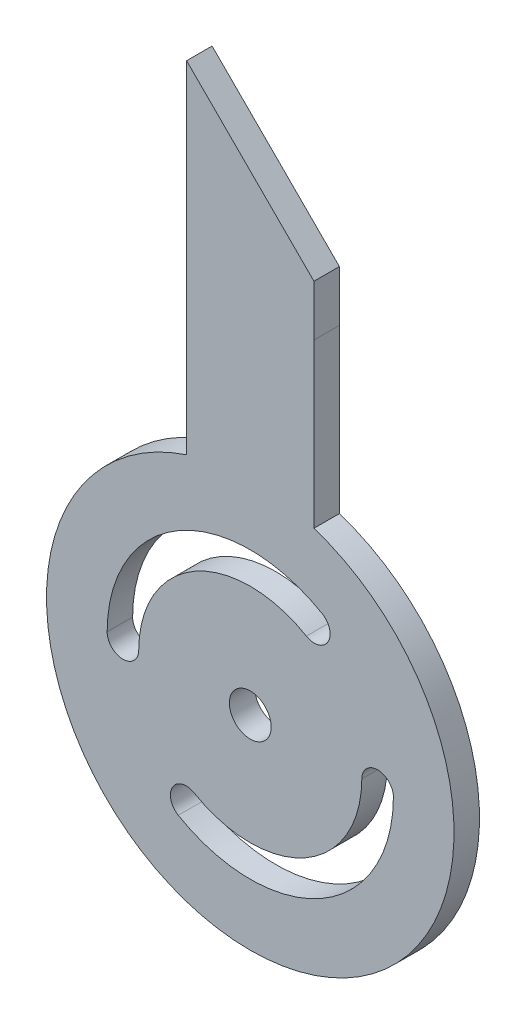
ISO-10303-21;
HEADER;
FILE_DESCRIPTION(('STEP AP214'),'2;1');
FILE_NAME('part.step','',(''),(''),'','','');
FILE_SCHEMA(('AUTOMOTIVE_DESIGN { 1 0 10303 214 1 1 1 1 }'));
ENDSEC;
DATA;
#1=APPLICATION_CONTEXT('core data for automotive mechanical design processes');
#2=APPLICATION_PROTOCOL_DEFINITION('international standard','automotive_design',2000,#1);
#3=PRODUCT_CONTEXT('',#1,'mechanical');
#4=PRODUCT('Part','Part','',(#3));
#5=PRODUCT_RELATED_PRODUCT_CATEGORY('part','',(#4));
#6=PRODUCT_DEFINITION_FORMATION('','',#4);
#7=PRODUCT_DEFINITION_CONTEXT('part definition',#1,'design');
#8=PRODUCT_DEFINITION('design','',#6,#7);
#9=PRODUCT_DEFINITION_SHAPE('','',#8);
#10=(LENGTH_UNIT() NAMED_UNIT(*) SI_UNIT(.MILLI.,.METRE.));
#11=(NAMED_UNIT(*) PLANE_ANGLE_UNIT() SI_UNIT($,.RADIAN.));
#12=(NAMED_UNIT(*) SI_UNIT($,.STERADIAN.) SOLID_ANGLE_UNIT());
#13=UNCERTAINTY_MEASURE_WITH_UNIT(LENGTH_MEASURE(1.E-05),#10,'distance_accuracy_value','');
#14=(GEOMETRIC_REPRESENTATION_CONTEXT(3) GLOBAL_UNCERTAINTY_ASSIGNED_CONTEXT((#13)) GLOBAL_UNIT_ASSIGNED_CONTEXT((#10,
#11,#12)) REPRESENTATION_CONTEXT('',''));
#15=CARTESIAN_POINT('',(0.,0.,0.));
#16=DIRECTION('',(0.,0.,1.));
#17=DIRECTION('',(1.,0.,0.));
#18=AXIS2_PLACEMENT_3D('',#15,#16,#17);
#19=CARTESIAN_POINT('',(0.,0.,5.));
#20=DIRECTION('',(0.,0.,1.));
#21=DIRECTION('',(1.,0.,0.));
#22=AXIS2_PLACEMENT_3D('',#19,#20,#21);
#23=PLANE('',#22);
#24=DIRECTION('',(-0.707141118954938,0.707072441750602,0.));
#25=VECTOR('',#24,1.);
#26=CARTESIAN_POINT('',(12.5024282237675,80.0000000000137,5.));
#27=LINE('',#26,#25);
#28=CARTESIAN_POINT('',(12.5024282237675,80.0000000000137,5.));
#29=VERTEX_POINT('',#28);
#30=CARTESIAN_POINT('',(-12.4975717762325,104.997572012074,5.));
#31=VERTEX_POINT('',#30);
#32=EDGE_CURVE('E52',#29,#31,#27,.T.);
#33=ORIENTED_EDGE('',*,*,#32,.T.);
#34=DIRECTION('',(0.,1.,0.));
#35=VECTOR('',#34,1.);
#36=CARTESIAN_POINT('',(-12.4975717762325,70.0000000000137,5.));
#37=LINE('',#36,#35);
#38=CARTESIAN_POINT('',(-12.4975717762325,94.9975720120604,5.));
#39=VERTEX_POINT('',#38);
#40=EDGE_CURVE('E190',#39,#31,#37,.T.);
#41=ORIENTED_EDGE('',*,*,#40,.F.);
#42=DIRECTION('',(0.707141118955131,-0.707072441750409,0.));
#43=VECTOR('',#42,1.);
#44=CARTESIAN_POINT('',(-12.5,95.,5.));
#45=LINE('',#44,#43);
#46=CARTESIAN_POINT('',(-12.5,95.,5.));
#47=VERTEX_POINT('',#46);
#48=EDGE_CURVE('E253',#47,#39,#45,.T.);
#49=ORIENTED_EDGE('',*,*,#48,.F.);
#50=DIRECTION('',(0.,-1.,0.));
#51=VECTOR('',#50,1.);
#52=CARTESIAN_POINT('',(-12.5,70.,5.));
#53=LINE('',#52,#51);
#54=CARTESIAN_POINT('',(-12.5,37.9967103839266,5.));
#55=VERTEX_POINT('',#54);
#56=EDGE_CURVE('E242',#47,#55,#53,.T.);
#57=ORIENTED_EDGE('',*,*,#56,.T.);
#58=CARTESIAN_POINT('',(0.,0.,5.));
#59=DIRECTION('',(0.,0.,1.));
#60=DIRECTION('',(1.,0.,0.));
#61=AXIS2_PLACEMENT_3D('',#58,#59,#60);
#62=CIRCLE('',#61,40.);
#63=CARTESIAN_POINT('',(12.5,37.9967103839266,5.));
#64=VERTEX_POINT('',#63);
#65=EDGE_CURVE('E266',#55,#64,#62,.T.);
#66=ORIENTED_EDGE('',*,*,#65,.T.);
#67=DIRECTION('',(0.,1.,0.));
#68=VECTOR('',#67,1.);
#69=CARTESIAN_POINT('',(12.5,70.,5.));
#70=LINE('',#69,#68);
#71=CARTESIAN_POINT('',(12.5012141118837,70.0000000000137,5.));
#72=VERTEX_POINT('',#71);
#73=EDGE_CURVE('E250',#64,#72,#70,.T.);
#74=ORIENTED_EDGE('',*,*,#73,.T.);
#75=DIRECTION('',(0.,-1.,0.));
#76=VECTOR('',#75,1.);
#77=CARTESIAN_POINT('',(12.5024282237675,70.0000000000137,5.));
#78=LINE('',#77,#76);
#79=EDGE_CURVE('E38',#29,#72,#78,.T.);
#80=ORIENTED_EDGE('',*,*,#79,.F.);
#81=EDGE_LOOP('',(#33,#41,#49,#57,#66,#74,#80));
#82=FACE_BOUND('',#81,.T.);
#83=CARTESIAN_POINT('',(25.0004408613556,0.0857187054202668,5.));
#84=DIRECTION('',(0.,0.,-1.));
#85=DIRECTION('',(-1.,0.,0.));
#86=AXIS2_PLACEMENT_3D('',#83,#84,#85);
#87=CIRCLE('',#86,3.1);
#88=CARTESIAN_POINT('',(21.9004590836964,0.0963478248924698,5.));
#89=VERTEX_POINT('',#88);
#90=CARTESIAN_POINT('',(28.1004226390149,0.0750895859480742,5.));
#91=VERTEX_POINT('',#90);
#92=EDGE_CURVE('E175',#89,#91,#87,.T.);
#93=ORIENTED_EDGE('',*,*,#92,.T.);
#94=CARTESIAN_POINT('',(0.000587815716733553,0.171437410841222,5.));
#95=DIRECTION('',(0.,0.,-1.));
#96=DIRECTION('',(-1.,0.,0.));
#97=AXIS2_PLACEMENT_3D('',#94,#95,#96);
#98=CIRCLE('',#97,28.1);
#99=CARTESIAN_POINT('',(-14.1327692598893,-24.1155594758349,5.));
#100=VERTEX_POINT('',#99);
#101=EDGE_CURVE('E178',#91,#100,#98,.T.);
#102=ORIENTED_EDGE('',*,*,#101,.T.);
#103=CARTESIAN_POINT('',(-12.5735732835769,-21.4362110648493,5.));
#104=DIRECTION('',(0.,0.,-1.));
#105=DIRECTION('',(-1.,0.,0.));
#106=AXIS2_PLACEMENT_3D('',#103,#104,#105);
#107=CIRCLE('',#106,3.1);
#108=CARTESIAN_POINT('',(-11.0143773072645,-18.7568626538637,5.));
#109=VERTEX_POINT('',#108);
#110=EDGE_CURVE('E60',#100,#109,#107,.T.);
#111=ORIENTED_EDGE('',*,*,#110,.T.);
#112=CARTESIAN_POINT('',(0.000587815716733553,0.171437410841222,5.));
#113=DIRECTION('',(0.,0.,1.));
#114=DIRECTION('',(-1.,0.,0.));
#115=AXIS2_PLACEMENT_3D('',#112,#113,#114);
#116=CIRCLE('',#115,21.9);
#117=EDGE_CURVE('E183',#109,#89,#116,.T.);
#118=ORIENTED_EDGE('',*,*,#117,.T.);
#119=EDGE_LOOP('',(#93,#102,#111,#118));
#120=FACE_BOUND('',#119,.T.);
#121=CARTESIAN_POINT('',(-24.9998530456389,0.0857187054211297,5.));
#122=DIRECTION('',(0.,0.,-1.));
#123=DIRECTION('',(-1.,0.,0.));
#124=AXIS2_PLACEMENT_3D('',#121,#122,#123);
#125=CIRCLE('',#124,3.1);
#126=CARTESIAN_POINT('',(-21.8998712679797,0.0750895859489096,5.));
#127=VERTEX_POINT('',#126);
#128=CARTESIAN_POINT('',(-28.0998348232981,0.0963478248933498,5.));
#129=VERTEX_POINT('',#128);
#130=EDGE_CURVE('E207',#127,#129,#125,.T.);
#131=ORIENTED_EDGE('',*,*,#130,.T.);
#132=CARTESIAN_POINT('',(0.,0.,5.));
#133=DIRECTION('',(0.,0.,-1.));
#134=DIRECTION('',(-1.,0.,0.));
#135=AXIS2_PLACEMENT_3D('',#132,#133,#134);
#136=CIRCLE('',#135,28.1);
#137=CARTESIAN_POINT('',(14.1333570756062,24.2869968866761,5.));
#138=VERTEX_POINT('',#137);
#139=EDGE_CURVE('E210',#129,#138,#136,.T.);
#140=ORIENTED_EDGE('',*,*,#139,.T.);
#141=CARTESIAN_POINT('',(12.5741610992938,21.6076484756904,5.));
#142=DIRECTION('',(0.,0.,-1.));
#143=DIRECTION('',(-1.,0.,0.));
#144=AXIS2_PLACEMENT_3D('',#141,#142,#143);
#145=CIRCLE('',#144,3.1);
#146=CARTESIAN_POINT('',(11.0149651229813,18.9283000647048,5.));
#147=VERTEX_POINT('',#146);
#148=EDGE_CURVE('E214',#138,#147,#145,.T.);
#149=ORIENTED_EDGE('',*,*,#148,.T.);
#150=CARTESIAN_POINT('',(0.,0.,5.));
#151=DIRECTION('',(0.,0.,1.));
#152=DIRECTION('',(-1.,0.,0.));
#153=AXIS2_PLACEMENT_3D('',#150,#151,#152);
#154=CIRCLE('',#153,21.9);
#155=EDGE_CURVE('E217',#147,#127,#154,.T.);
#156=ORIENTED_EDGE('',*,*,#155,.T.);
#157=EDGE_LOOP('',(#131,#140,#149,#156));
#158=FACE_BOUND('',#157,.T.);
#159=CARTESIAN_POINT('',(0.,0.,5.));
#160=DIRECTION('',(0.,0.,-1.));
#161=DIRECTION('',(-1.,0.,0.));
#162=AXIS2_PLACEMENT_3D('',#159,#160,#161);
#163=CIRCLE('',#162,4.1);
#164=CARTESIAN_POINT('',(-4.1,0.,5.));
#165=VERTEX_POINT('',#164);
#166=EDGE_CURVE('E239',#165,#165,#163,.T.);
#167=ORIENTED_EDGE('',*,*,#166,.T.);
#168=EDGE_LOOP('',(#167));
#169=FACE_BOUND('',#168,.T.);
#170=ADVANCED_FACE('F35',(#82,#120,#158,#169),#23,.T.);
#171=CARTESIAN_POINT('',(0.,0.,0.));
#172=DIRECTION('',(0.,0.,1.));
#173=DIRECTION('',(1.,0.,0.));
#174=AXIS2_PLACEMENT_3D('',#171,#172,#173);
#175=PLANE('',#174);
#176=CARTESIAN_POINT('',(0.000587815716733553,0.171437410841222,0.));
#177=DIRECTION('',(0.,0.,-1.));
#178=DIRECTION('',(-1.,0.,0.));
#179=AXIS2_PLACEMENT_3D('',#176,#177,#178);
#180=CIRCLE('',#179,28.1);
#181=CARTESIAN_POINT('',(28.1004226390149,0.0750895859480742,0.));
#182=VERTEX_POINT('',#181);
#183=CARTESIAN_POINT('',(-14.1327692598893,-24.1155594758349,0.));
#184=VERTEX_POINT('',#183);
#185=EDGE_CURVE('E189',#182,#184,#180,.T.);
#186=ORIENTED_EDGE('',*,*,#185,.F.);
#187=CARTESIAN_POINT('',(25.0004408613556,0.0857187054202668,0.));
#188=DIRECTION('',(0.,0.,-1.));
#189=DIRECTION('',(-1.,0.,0.));
#190=AXIS2_PLACEMENT_3D('',#187,#188,#189);
#191=CIRCLE('',#190,3.1);
#192=CARTESIAN_POINT('',(21.9004590836964,0.0963478248924698,0.));
#193=VERTEX_POINT('',#192);
#194=EDGE_CURVE('E187',#193,#182,#191,.T.);
#195=ORIENTED_EDGE('',*,*,#194,.F.);
#196=CARTESIAN_POINT('',(0.000587815716733553,0.171437410841222,0.));
#197=DIRECTION('',(0.,0.,1.));
#198=DIRECTION('',(-1.,0.,0.));
#199=AXIS2_PLACEMENT_3D('',#196,#197,#198);
#200=CIRCLE('',#199,21.9);
#201=CARTESIAN_POINT('',(-11.0143773072645,-18.7568626538637,0.));
#202=VERTEX_POINT('',#201);
#203=EDGE_CURVE('E179',#202,#193,#200,.T.);
#204=ORIENTED_EDGE('',*,*,#203,.F.);
#205=CARTESIAN_POINT('',(-12.5735732835769,-21.4362110648493,0.));
#206=DIRECTION('',(0.,0.,-1.));
#207=DIRECTION('',(-1.,0.,0.));
#208=AXIS2_PLACEMENT_3D('',#205,#206,#207);
#209=CIRCLE('',#208,3.1);
#210=EDGE_CURVE('E193',#184,#202,#209,.T.);
#211=ORIENTED_EDGE('',*,*,#210,.F.);
#212=EDGE_LOOP('',(#186,#195,#204,#211));
#213=FACE_BOUND('',#212,.T.);
#214=CARTESIAN_POINT('',(0.,0.,0.));
#215=DIRECTION('',(0.,0.,-1.));
#216=DIRECTION('',(-1.,0.,0.));
#217=AXIS2_PLACEMENT_3D('',#214,#215,#216);
#218=CIRCLE('',#217,28.1);
#219=CARTESIAN_POINT('',(-28.0998348232981,0.0963478248933498,0.));
#220=VERTEX_POINT('',#219);
#221=CARTESIAN_POINT('',(14.1333570756062,24.2869968866761,0.));
#222=VERTEX_POINT('',#221);
#223=EDGE_CURVE('E222',#220,#222,#218,.T.);
#224=ORIENTED_EDGE('',*,*,#223,.F.);
#225=CARTESIAN_POINT('',(-24.9998530456389,0.0857187054211297,0.));
#226=DIRECTION('',(0.,0.,-1.));
#227=DIRECTION('',(-1.,0.,0.));
#228=AXIS2_PLACEMENT_3D('',#225,#226,#227);
#229=CIRCLE('',#228,3.1);
#230=CARTESIAN_POINT('',(-21.8998712679797,0.0750895859489096,0.));
#231=VERTEX_POINT('',#230);
#232=EDGE_CURVE('E200',#231,#220,#229,.T.);
#233=ORIENTED_EDGE('',*,*,#232,.F.);
#234=CARTESIAN_POINT('',(0.,0.,0.));
#235=DIRECTION('',(0.,0.,1.));
#236=DIRECTION('',(-1.,0.,0.));
#237=AXIS2_PLACEMENT_3D('',#234,#235,#236);
#238=CIRCLE('',#237,21.9);
#239=CARTESIAN_POINT('',(11.0149651229813,18.9283000647048,0.));
#240=VERTEX_POINT('',#239);
#241=EDGE_CURVE('E211',#240,#231,#238,.T.);
#242=ORIENTED_EDGE('',*,*,#241,.F.);
#243=CARTESIAN_POINT('',(12.5741610992938,21.6076484756904,0.));
#244=DIRECTION('',(0.,0.,-1.));
#245=DIRECTION('',(-1.,0.,0.));
#246=AXIS2_PLACEMENT_3D('',#243,#244,#245);
#247=CIRCLE('',#246,3.1);
#248=EDGE_CURVE('E225',#222,#240,#247,.T.);
#249=ORIENTED_EDGE('',*,*,#248,.F.);
#250=EDGE_LOOP('',(#224,#233,#242,#249));
#251=FACE_BOUND('',#250,.T.);
#252=CARTESIAN_POINT('',(0.,0.,0.));
#253=DIRECTION('',(0.,0.,-1.));
#254=DIRECTION('',(-1.,0.,0.));
#255=AXIS2_PLACEMENT_3D('',#252,#253,#254);
#256=CIRCLE('',#255,4.1);
#257=CARTESIAN_POINT('',(-4.1,0.,0.));
#258=VERTEX_POINT('',#257);
#259=EDGE_CURVE('E232',#258,#258,#256,.T.);
#260=ORIENTED_EDGE('',*,*,#259,.F.);
#261=EDGE_LOOP('',(#260));
#262=FACE_BOUND('',#261,.T.);
#263=DIRECTION('',(0.,1.,0.));
#264=VECTOR('',#263,1.);
#265=CARTESIAN_POINT('',(-12.4975717762325,70.0000000000137,0.));
#266=LINE('',#265,#264);
#267=CARTESIAN_POINT('',(-12.4975717762325,94.9975720120604,0.));
#268=VERTEX_POINT('',#267);
#269=CARTESIAN_POINT('',(-12.4975717762325,104.997572012074,0.));
#270=VERTEX_POINT('',#269);
#271=EDGE_CURVE('E157',#268,#270,#266,.T.);
#272=ORIENTED_EDGE('',*,*,#271,.T.);
#273=DIRECTION('',(-0.707141118954938,0.707072441750602,0.));
#274=VECTOR('',#273,1.);
#275=CARTESIAN_POINT('',(12.5024282237675,80.0000000000137,0.));
#276=LINE('',#275,#274);
#277=CARTESIAN_POINT('',(12.5024282237675,80.0000000000137,0.));
#278=VERTEX_POINT('',#277);
#279=EDGE_CURVE('E144',#278,#270,#276,.T.);
#280=ORIENTED_EDGE('',*,*,#279,.F.);
#281=DIRECTION('',(0.,-1.,0.));
#282=VECTOR('',#281,1.);
#283=CARTESIAN_POINT('',(12.5024282237675,70.0000000000137,0.));
#284=LINE('',#283,#282);
#285=CARTESIAN_POINT('',(12.5012141118837,70.0000000000137,0.));
#286=VERTEX_POINT('',#285);
#287=EDGE_CURVE('E154',#278,#286,#284,.T.);
#288=ORIENTED_EDGE('',*,*,#287,.T.);
#289=DIRECTION('',(0.,1.,0.));
#290=VECTOR('',#289,1.);
#291=CARTESIAN_POINT('',(12.5,70.,0.));
#292=LINE('',#291,#290);
#293=CARTESIAN_POINT('',(12.5,37.9967103839266,0.));
#294=VERTEX_POINT('',#293);
#295=EDGE_CURVE('E259',#294,#286,#292,.T.);
#296=ORIENTED_EDGE('',*,*,#295,.F.);
#297=CARTESIAN_POINT('',(0.,0.,0.));
#298=DIRECTION('',(0.,0.,1.));
#299=DIRECTION('',(1.,0.,0.));
#300=AXIS2_PLACEMENT_3D('',#297,#298,#299);
#301=CIRCLE('',#300,40.);
#302=CARTESIAN_POINT('',(-12.5,37.9967103839266,0.));
#303=VERTEX_POINT('',#302);
#304=EDGE_CURVE('E249',#303,#294,#301,.T.);
#305=ORIENTED_EDGE('',*,*,#304,.F.);
#306=DIRECTION('',(0.,-1.,0.));
#307=VECTOR('',#306,1.);
#308=CARTESIAN_POINT('',(-12.5,70.,0.));
#309=LINE('',#308,#307);
#310=CARTESIAN_POINT('',(-12.5,95.,0.));
#311=VERTEX_POINT('',#310);
#312=EDGE_CURVE('E256',#311,#303,#309,.T.);
#313=ORIENTED_EDGE('',*,*,#312,.F.);
#314=DIRECTION('',(0.707141118955131,-0.707072441750409,0.));
#315=VECTOR('',#314,1.);
#316=CARTESIAN_POINT('',(-12.5,95.,0.));
#317=LINE('',#316,#315);
#318=EDGE_CURVE('E247',#311,#268,#317,.T.);
#319=ORIENTED_EDGE('',*,*,#318,.T.);
#320=EDGE_LOOP('',(#272,#280,#288,#296,#305,#313,#319));
#321=FACE_BOUND('',#320,.T.);
#322=ADVANCED_FACE('F153',(#213,#251,#262,#321),#175,.F.);
#323=CARTESIAN_POINT('',(0.,0.,5.));
#324=DIRECTION('',(0.,0.,-1.));
#325=DIRECTION('',(-1.,0.,0.));
#326=AXIS2_PLACEMENT_3D('',#323,#324,#325);
#327=CYLINDRICAL_SURFACE('',#326,40.);
#328=ORIENTED_EDGE('',*,*,#304,.T.);
#329=DIRECTION('',(0.,0.,-1.));
#330=VECTOR('',#329,1.);
#331=CARTESIAN_POINT('',(12.5,37.9967103839266,5.));
#332=LINE('',#331,#330);
#333=EDGE_CURVE('E483',#64,#294,#332,.T.);
#334=ORIENTED_EDGE('',*,*,#333,.F.);
#335=ORIENTED_EDGE('',*,*,#65,.F.);
#336=DIRECTION('',(0.,0.,-1.));
#337=VECTOR('',#336,1.);
#338=CARTESIAN_POINT('',(-12.5,37.9967103839266,5.));
#339=LINE('',#338,#337);
#340=EDGE_CURVE('E261',#55,#303,#339,.T.);
#341=ORIENTED_EDGE('',*,*,#340,.T.);
#342=EDGE_LOOP('',(#328,#334,#335,#341));
#343=FACE_BOUND('',#342,.T.);
#344=ADVANCED_FACE('F283',(#343),#327,.T.);
#345=CARTESIAN_POINT('',(12.5,70.,5.));
#346=DIRECTION('',(-1.,0.,0.));
#347=DIRECTION('',(0.,-1.,0.));
#348=AXIS2_PLACEMENT_3D('',#345,#346,#347);
#349=PLANE('',#348);
#350=ORIENTED_EDGE('',*,*,#295,.T.);
#351=CARTESIAN_POINT('',(12.5024282237675,70.0000000000137,5.));
#352=DIRECTION('',(0.,0.,-1.));
#353=VECTOR('',#352,1.);
#354=LINE('',#351,#353);
#355=EDGE_CURVE('E161',#72,#286,#354,.T.);
#356=ORIENTED_EDGE('',*,*,#355,.F.);
#357=ORIENTED_EDGE('',*,*,#73,.F.);
#358=ORIENTED_EDGE('',*,*,#333,.T.);
#359=EDGE_LOOP('',(#350,#356,#357,#358));
#360=FACE_BOUND('',#359,.T.);
#361=ADVANCED_FACE('F272',(#360),#349,.F.);
#362=CARTESIAN_POINT('',(-12.5,70.,5.));
#363=DIRECTION('',(1.,0.,0.));
#364=DIRECTION('',(0.,1.,0.));
#365=AXIS2_PLACEMENT_3D('',#362,#363,#364);
#366=PLANE('',#365);
#367=ORIENTED_EDGE('',*,*,#312,.T.);
#368=ORIENTED_EDGE('',*,*,#340,.F.);
#369=ORIENTED_EDGE('',*,*,#56,.F.);
#370=DIRECTION('',(0.,0.,1.));
#371=VECTOR('',#370,1.);
#372=CARTESIAN_POINT('',(-12.5,95.,0.));
#373=LINE('',#372,#371);
#374=EDGE_CURVE('E44',#311,#47,#373,.T.);
#375=ORIENTED_EDGE('',*,*,#374,.F.);
#376=EDGE_LOOP('',(#367,#368,#369,#375));
#377=FACE_BOUND('',#376,.T.);
#378=ADVANCED_FACE('F282',(#377),#366,.F.);
#379=CARTESIAN_POINT('',(-12.5,95.,0.));
#380=DIRECTION('',(-0.707072441750409,-0.707141118955131,0.));
#381=DIRECTION('',(0.707141118955131,-0.707072441750409,0.));
#382=AXIS2_PLACEMENT_3D('',#379,#380,#381);
#383=PLANE('',#382);
#384=ORIENTED_EDGE('',*,*,#48,.T.);
#385=DIRECTION('',(0.,0.,-1.));
#386=VECTOR('',#385,1.);
#387=CARTESIAN_POINT('',(-12.4975717762325,94.9975720120604,0.));
#388=LINE('',#387,#386);
#389=EDGE_CURVE('E11',#39,#268,#388,.T.);
#390=ORIENTED_EDGE('',*,*,#389,.T.);
#391=ORIENTED_EDGE('',*,*,#318,.F.);
#392=ORIENTED_EDGE('',*,*,#374,.T.);
#393=EDGE_LOOP('',(#384,#390,#391,#392));
#394=FACE_BOUND('',#393,.T.);
#395=ADVANCED_FACE('F288',(#394),#383,.F.);
#396=CARTESIAN_POINT('',(0.,0.,5.));
#397=DIRECTION('',(0.,0.,-1.));
#398=DIRECTION('',(-1.,0.,0.));
#399=AXIS2_PLACEMENT_3D('',#396,#397,#398);
#400=CYLINDRICAL_SURFACE('',#399,4.1);
#401=ORIENTED_EDGE('',*,*,#166,.F.);
#402=EDGE_LOOP('',(#401));
#403=FACE_BOUND('',#402,.T.);
#404=ORIENTED_EDGE('',*,*,#259,.T.);
#405=EDGE_LOOP('',(#404));
#406=FACE_BOUND('',#405,.T.);
#407=ADVANCED_FACE('F291',(#403,#406),#400,.F.);
#408=CARTESIAN_POINT('',(-24.9998530456389,0.0857187054211297,5.));
#409=DIRECTION('',(0.,0.,-1.));
#410=DIRECTION('',(-1.,0.,0.));
#411=AXIS2_PLACEMENT_3D('',#408,#409,#410);
#412=CYLINDRICAL_SURFACE('',#411,3.1);
#413=ORIENTED_EDGE('',*,*,#232,.T.);
#414=DIRECTION('',(0.,0.,-1.));
#415=VECTOR('',#414,1.);
#416=CARTESIAN_POINT('',(-28.0998348232981,0.0963478248933498,5.));
#417=LINE('',#416,#415);
#418=EDGE_CURVE('E220',#129,#220,#417,.T.);
#419=ORIENTED_EDGE('',*,*,#418,.F.);
#420=ORIENTED_EDGE('',*,*,#130,.F.);
#421=DIRECTION('',(0.,0.,-1.));
#422=VECTOR('',#421,1.);
#423=CARTESIAN_POINT('',(-21.8998712679797,0.0750895859489096,5.));
#424=LINE('',#423,#422);
#425=EDGE_CURVE('E230',#127,#231,#424,.T.);
#426=ORIENTED_EDGE('',*,*,#425,.T.);
#427=EDGE_LOOP('',(#413,#419,#420,#426));
#428=FACE_BOUND('',#427,.T.);
#429=ADVANCED_FACE('F312',(#428),#412,.F.);
#430=CARTESIAN_POINT('',(0.,0.,5.));
#431=DIRECTION('',(0.,0.,-1.));
#432=DIRECTION('',(-1.,0.,0.));
#433=AXIS2_PLACEMENT_3D('',#430,#431,#432);
#434=CYLINDRICAL_SURFACE('',#433,21.9);
#435=ORIENTED_EDGE('',*,*,#241,.T.);
#436=ORIENTED_EDGE('',*,*,#425,.F.);
#437=ORIENTED_EDGE('',*,*,#155,.F.);
#438=DIRECTION('',(0.,0.,-1.));
#439=VECTOR('',#438,1.);
#440=CARTESIAN_POINT('',(11.0149651229813,18.9283000647048,5.));
#441=LINE('',#440,#439);
#442=EDGE_CURVE('E233',#147,#240,#441,.T.);
#443=ORIENTED_EDGE('',*,*,#442,.T.);
#444=EDGE_LOOP('',(#435,#436,#437,#443));
#445=FACE_BOUND('',#444,.T.);
#446=ADVANCED_FACE('F317',(#445),#434,.T.);
#447=CARTESIAN_POINT('',(12.5741610992938,21.6076484756904,5.));
#448=DIRECTION('',(0.,0.,-1.));
#449=DIRECTION('',(-1.,0.,0.));
#450=AXIS2_PLACEMENT_3D('',#447,#448,#449);
#451=CYLINDRICAL_SURFACE('',#450,3.1);
#452=ORIENTED_EDGE('',*,*,#248,.T.);
#453=ORIENTED_EDGE('',*,*,#442,.F.);
#454=ORIENTED_EDGE('',*,*,#148,.F.);
#455=DIRECTION('',(0.,0.,-1.));
#456=VECTOR('',#455,1.);
#457=CARTESIAN_POINT('',(14.1333570756062,24.2869968866761,5.));
#458=LINE('',#457,#456);
#459=EDGE_CURVE('E235',#138,#222,#458,.T.);
#460=ORIENTED_EDGE('',*,*,#459,.T.);
#461=EDGE_LOOP('',(#452,#453,#454,#460));
#462=FACE_BOUND('',#461,.T.);
#463=ADVANCED_FACE('F326',(#462),#451,.F.);
#464=CARTESIAN_POINT('',(0.,0.,5.));
#465=DIRECTION('',(0.,0.,-1.));
#466=DIRECTION('',(-1.,0.,0.));
#467=AXIS2_PLACEMENT_3D('',#464,#465,#466);
#468=CYLINDRICAL_SURFACE('',#467,28.1);
#469=ORIENTED_EDGE('',*,*,#223,.T.);
#470=ORIENTED_EDGE('',*,*,#459,.F.);
#471=ORIENTED_EDGE('',*,*,#139,.F.);
#472=ORIENTED_EDGE('',*,*,#418,.T.);
#473=EDGE_LOOP('',(#469,#470,#471,#472));
#474=FACE_BOUND('',#473,.T.);
#475=ADVANCED_FACE('F322',(#474),#468,.F.);
#476=CARTESIAN_POINT('',(25.0004408613556,0.0857187054202668,5.));
#477=DIRECTION('',(0.,0.,-1.));
#478=DIRECTION('',(-1.,0.,0.));
#479=AXIS2_PLACEMENT_3D('',#476,#477,#478);
#480=CYLINDRICAL_SURFACE('',#479,3.1);
#481=ORIENTED_EDGE('',*,*,#194,.T.);
#482=DIRECTION('',(0.,0.,-1.));
#483=VECTOR('',#482,1.);
#484=CARTESIAN_POINT('',(28.1004226390149,0.0750895859480742,5.));
#485=LINE('',#484,#483);
#486=EDGE_CURVE('E186',#91,#182,#485,.T.);
#487=ORIENTED_EDGE('',*,*,#486,.F.);
#488=ORIENTED_EDGE('',*,*,#92,.F.);
#489=DIRECTION('',(0.,0.,-1.));
#490=VECTOR('',#489,1.);
#491=CARTESIAN_POINT('',(21.9004590836964,0.0963478248924698,5.));
#492=LINE('',#491,#490);
#493=EDGE_CURVE('E198',#89,#193,#492,.T.);
#494=ORIENTED_EDGE('',*,*,#493,.T.);
#495=EDGE_LOOP('',(#481,#487,#488,#494));
#496=FACE_BOUND('',#495,.T.);
#497=ADVANCED_FACE('F325',(#496),#480,.F.);
#498=CARTESIAN_POINT('',(0.000587815716733553,0.171437410841222,5.));
#499=DIRECTION('',(0.,0.,-1.));
#500=DIRECTION('',(-1.,0.,0.));
#501=AXIS2_PLACEMENT_3D('',#498,#499,#500);
#502=CYLINDRICAL_SURFACE('',#501,21.9);
#503=ORIENTED_EDGE('',*,*,#203,.T.);
#504=ORIENTED_EDGE('',*,*,#493,.F.);
#505=ORIENTED_EDGE('',*,*,#117,.F.);
#506=DIRECTION('',(0.,0.,-1.));
#507=VECTOR('',#506,1.);
#508=CARTESIAN_POINT('',(-11.0143773072645,-18.7568626538637,5.));
#509=LINE('',#508,#507);
#510=EDGE_CURVE('E201',#109,#202,#509,.T.);
#511=ORIENTED_EDGE('',*,*,#510,.T.);
#512=EDGE_LOOP('',(#503,#504,#505,#511));
#513=FACE_BOUND('',#512,.T.);
#514=ADVANCED_FACE('F336',(#513),#502,.T.);
#515=CARTESIAN_POINT('',(-12.5735732835769,-21.4362110648493,5.));
#516=DIRECTION('',(0.,0.,-1.));
#517=DIRECTION('',(-1.,0.,0.));
#518=AXIS2_PLACEMENT_3D('',#515,#516,#517);
#519=CYLINDRICAL_SURFACE('',#518,3.1);
#520=ORIENTED_EDGE('',*,*,#210,.T.);
#521=ORIENTED_EDGE('',*,*,#510,.F.);
#522=ORIENTED_EDGE('',*,*,#110,.F.);
#523=DIRECTION('',(0.,0.,-1.));
#524=VECTOR('',#523,1.);
#525=CARTESIAN_POINT('',(-14.1327692598893,-24.1155594758349,5.));
#526=LINE('',#525,#524);
#527=EDGE_CURVE('E203',#100,#184,#526,.T.);
#528=ORIENTED_EDGE('',*,*,#527,.T.);
#529=EDGE_LOOP('',(#520,#521,#522,#528));
#530=FACE_BOUND('',#529,.T.);
#531=ADVANCED_FACE('F342',(#530),#519,.F.);
#532=CARTESIAN_POINT('',(0.000587815716733553,0.171437410841222,5.));
#533=DIRECTION('',(0.,0.,-1.));
#534=DIRECTION('',(-1.,0.,0.));
#535=AXIS2_PLACEMENT_3D('',#532,#533,#534);
#536=CYLINDRICAL_SURFACE('',#535,28.1);
#537=ORIENTED_EDGE('',*,*,#185,.T.);
#538=ORIENTED_EDGE('',*,*,#527,.F.);
#539=ORIENTED_EDGE('',*,*,#101,.F.);
#540=ORIENTED_EDGE('',*,*,#486,.T.);
#541=EDGE_LOOP('',(#537,#538,#539,#540));
#542=FACE_BOUND('',#541,.T.);
#543=ADVANCED_FACE('F338',(#542),#536,.F.);
#544=CARTESIAN_POINT('',(-12.4975717762325,70.0000000000137,5.));
#545=DIRECTION('',(-1.,0.,0.));
#546=DIRECTION('',(0.,0.,1.));
#547=AXIS2_PLACEMENT_3D('',#544,#545,#546);
#548=PLANE('',#547);
#549=DIRECTION('',(0.,0.,1.));
#550=VECTOR('',#549,1.);
#551=CARTESIAN_POINT('',(-12.4975717762325,104.997572012074,5.));
#552=LINE('',#551,#550);
#553=EDGE_CURVE('E149',#270,#31,#552,.T.);
#554=ORIENTED_EDGE('',*,*,#553,.F.);
#555=ORIENTED_EDGE('',*,*,#271,.F.);
#556=ORIENTED_EDGE('',*,*,#389,.F.);
#557=ORIENTED_EDGE('',*,*,#40,.T.);
#558=EDGE_LOOP('',(#554,#555,#556,#557));
#559=FACE_BOUND('',#558,.T.);
#560=ADVANCED_FACE('F341',(#559),#548,.T.);
#561=CARTESIAN_POINT('',(12.5024282237675,70.0000000000137,5.));
#562=DIRECTION('',(1.,0.,0.));
#563=DIRECTION('',(0.,0.,-1.));
#564=AXIS2_PLACEMENT_3D('',#561,#562,#563);
#565=PLANE('',#564);
#566=DIRECTION('',(0.,0.,-1.));
#567=VECTOR('',#566,1.);
#568=CARTESIAN_POINT('',(12.5024282237675,80.0000000000137,5.));
#569=LINE('',#568,#567);
#570=EDGE_CURVE('E141',#29,#278,#569,.T.);
#571=ORIENTED_EDGE('',*,*,#570,.F.);
#572=ORIENTED_EDGE('',*,*,#79,.T.);
#573=ORIENTED_EDGE('',*,*,#355,.T.);
#574=ORIENTED_EDGE('',*,*,#287,.F.);
#575=EDGE_LOOP('',(#571,#572,#573,#574));
#576=FACE_BOUND('',#575,.T.);
#577=ADVANCED_FACE('F159',(#576),#565,.T.);
#578=CARTESIAN_POINT('',(12.5024282237675,80.0000000000137,5.));
#579=DIRECTION('',(-0.707072441750602,-0.707141118954938,0.));
#580=DIRECTION('',(0.707141118954938,-0.707072441750602,0.));
#581=AXIS2_PLACEMENT_3D('',#578,#579,#580);
#582=PLANE('',#581);
#583=ORIENTED_EDGE('',*,*,#553,.T.);
#584=ORIENTED_EDGE('',*,*,#32,.F.);
#585=ORIENTED_EDGE('',*,*,#570,.T.);
#586=ORIENTED_EDGE('',*,*,#279,.T.);
#587=EDGE_LOOP('',(#583,#584,#585,#586));
#588=FACE_BOUND('',#587,.T.);
#589=ADVANCED_FACE('F143',(#588),#582,.F.);
#590=CLOSED_SHELL('',(#170,#322,#344,#361,#378,#395,#407,#429,#446,#463,#475,#497,#514,#531,
#543,#560,#577,#589));
#591=MANIFOLD_SOLID_BREP('B2',#590);
#592=ADVANCED_BREP_SHAPE_REPRESENTATION('',(#18,#591),#14);
#593=SHAPE_DEFINITION_REPRESENTATION(#9,#592);
ENDSEC;
END-ISO-10303-21;
